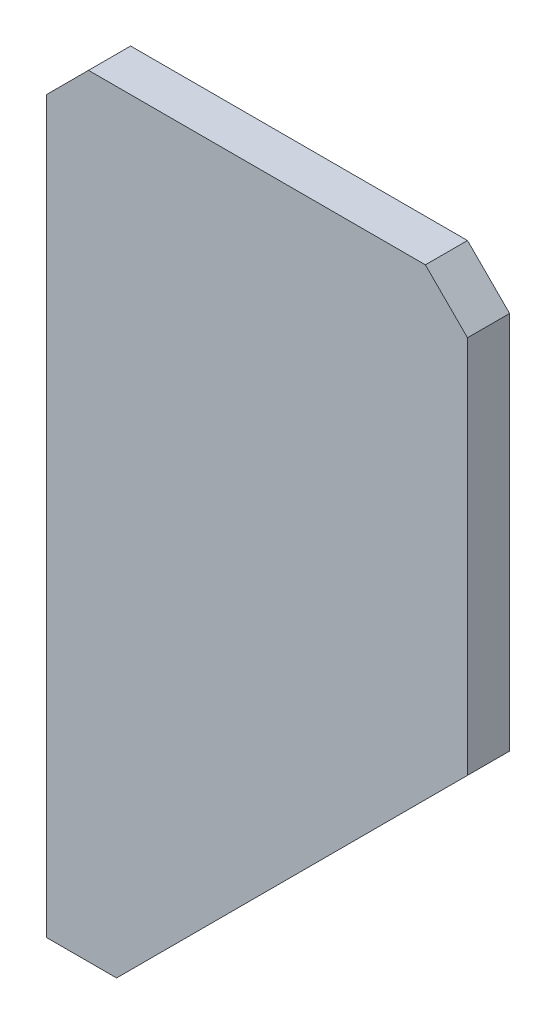
ISO-10303-21;
HEADER;
FILE_DESCRIPTION(('STEP AP214'),'2;1');
FILE_NAME('part.step','',(''),(''),'','','');
FILE_SCHEMA(('AUTOMOTIVE_DESIGN { 1 0 10303 214 1 1 1 1 }'));
ENDSEC;
DATA;
#1=APPLICATION_CONTEXT('core data for automotive mechanical design processes');
#2=APPLICATION_PROTOCOL_DEFINITION('international standard','automotive_design',2000,#1);
#3=PRODUCT_CONTEXT('',#1,'mechanical');
#4=PRODUCT('Part','Part','',(#3));
#5=PRODUCT_RELATED_PRODUCT_CATEGORY('part','',(#4));
#6=PRODUCT_DEFINITION_FORMATION('','',#4);
#7=PRODUCT_DEFINITION_CONTEXT('part definition',#1,'design');
#8=PRODUCT_DEFINITION('design','',#6,#7);
#9=PRODUCT_DEFINITION_SHAPE('','',#8);
#10=(LENGTH_UNIT() NAMED_UNIT(*) SI_UNIT(.MILLI.,.METRE.));
#11=(NAMED_UNIT(*) PLANE_ANGLE_UNIT() SI_UNIT($,.RADIAN.));
#12=(NAMED_UNIT(*) SI_UNIT($,.STERADIAN.) SOLID_ANGLE_UNIT());
#13=UNCERTAINTY_MEASURE_WITH_UNIT(LENGTH_MEASURE(1.E-05),#10,'distance_accuracy_value','');
#14=(GEOMETRIC_REPRESENTATION_CONTEXT(3) GLOBAL_UNCERTAINTY_ASSIGNED_CONTEXT((#13)) GLOBAL_UNIT_ASSIGNED_CONTEXT((#10,
#11,#12)) REPRESENTATION_CONTEXT('',''));
#15=CARTESIAN_POINT('',(0.,0.,0.));
#16=DIRECTION('',(0.,0.,1.));
#17=DIRECTION('',(1.,0.,0.));
#18=AXIS2_PLACEMENT_3D('',#15,#16,#17);
#19=CARTESIAN_POINT('',(15.,-27.5,1.5));
#20=DIRECTION('',(-1.,0.,0.));
#21=DIRECTION('',(0.,0.,1.));
#22=AXIS2_PLACEMENT_3D('',#19,#20,#21);
#23=PLANE('',#22);
#24=DIRECTION('',(0.,1.,0.));
#25=VECTOR('',#24,1.);
#26=CARTESIAN_POINT('',(15.,-27.5,1.5));
#27=LINE('',#26,#25);
#28=CARTESIAN_POINT('',(15.,-2.49999999999993,1.5));
#29=VERTEX_POINT('',#28);
#30=CARTESIAN_POINT('',(15.,24.5,1.5));
#31=VERTEX_POINT('',#30);
#32=EDGE_CURVE('E121',#29,#31,#27,.T.);
#33=ORIENTED_EDGE('',*,*,#32,.F.);
#34=DIRECTION('',(0.,0.,-1.));
#35=VECTOR('',#34,1.);
#36=CARTESIAN_POINT('',(15.,-2.49999999999993,1.5));
#37=LINE('',#36,#35);
#38=CARTESIAN_POINT('',(15.,-2.49999999999993,-1.5));
#39=VERTEX_POINT('',#38);
#40=EDGE_CURVE('E140',#29,#39,#37,.T.);
#41=ORIENTED_EDGE('',*,*,#40,.T.);
#42=DIRECTION('',(0.,1.,0.));
#43=VECTOR('',#42,1.);
#44=CARTESIAN_POINT('',(15.,-27.5,-1.5));
#45=LINE('',#44,#43);
#46=CARTESIAN_POINT('',(15.,24.5,-1.5));
#47=VERTEX_POINT('',#46);
#48=EDGE_CURVE('E114',#39,#47,#45,.T.);
#49=ORIENTED_EDGE('',*,*,#48,.T.);
#50=DIRECTION('',(0.,0.,1.));
#51=VECTOR('',#50,1.);
#52=CARTESIAN_POINT('',(15.,24.5,1.5));
#53=LINE('',#52,#51);
#54=EDGE_CURVE('E137',#47,#31,#53,.T.);
#55=ORIENTED_EDGE('',*,*,#54,.T.);
#56=EDGE_LOOP('',(#33,#41,#49,#55));
#57=FACE_BOUND('',#56,.T.);
#58=ADVANCED_FACE('F32',(#57),#23,.F.);
#59=CARTESIAN_POINT('',(-15.,27.5,1.5));
#60=DIRECTION('',(0.,-1.,0.));
#61=DIRECTION('',(0.,0.,-1.));
#62=AXIS2_PLACEMENT_3D('',#59,#60,#61);
#63=PLANE('',#62);
#64=DIRECTION('',(-1.,0.,0.));
#65=VECTOR('',#64,1.);
#66=CARTESIAN_POINT('',(-15.,27.5,-1.5));
#67=LINE('',#66,#65);
#68=CARTESIAN_POINT('',(12.,27.5,-1.5));
#69=VERTEX_POINT('',#68);
#70=CARTESIAN_POINT('',(-12.,27.5,-1.5));
#71=VERTEX_POINT('',#70);
#72=EDGE_CURVE('E116',#69,#71,#67,.T.);
#73=ORIENTED_EDGE('',*,*,#72,.T.);
#74=DIRECTION('',(0.,0.,1.));
#75=VECTOR('',#74,1.);
#76=CARTESIAN_POINT('',(-12.,27.5,1.5));
#77=LINE('',#76,#75);
#78=CARTESIAN_POINT('',(-12.,27.5,1.5));
#79=VERTEX_POINT('',#78);
#80=EDGE_CURVE('E132',#71,#79,#77,.T.);
#81=ORIENTED_EDGE('',*,*,#80,.T.);
#82=DIRECTION('',(-1.,0.,0.));
#83=VECTOR('',#82,1.);
#84=CARTESIAN_POINT('',(-15.,27.5,1.5));
#85=LINE('',#84,#83);
#86=CARTESIAN_POINT('',(12.,27.5,1.5));
#87=VERTEX_POINT('',#86);
#88=EDGE_CURVE('E101',#87,#79,#85,.T.);
#89=ORIENTED_EDGE('',*,*,#88,.F.);
#90=DIRECTION('',(0.,0.,-1.));
#91=VECTOR('',#90,1.);
#92=CARTESIAN_POINT('',(12.,27.5,1.5));
#93=LINE('',#92,#91);
#94=EDGE_CURVE('E129',#87,#69,#93,.T.);
#95=ORIENTED_EDGE('',*,*,#94,.T.);
#96=EDGE_LOOP('',(#73,#81,#89,#95));
#97=FACE_BOUND('',#96,.T.);
#98=ADVANCED_FACE('F156',(#97),#63,.F.);
#99=CARTESIAN_POINT('',(-15.,-27.5,1.5));
#100=DIRECTION('',(1.,0.,0.));
#101=DIRECTION('',(0.,0.,-1.));
#102=AXIS2_PLACEMENT_3D('',#99,#100,#101);
#103=PLANE('',#102);
#104=DIRECTION('',(0.,-1.,0.));
#105=VECTOR('',#104,1.);
#106=CARTESIAN_POINT('',(-15.,-27.5,1.5));
#107=LINE('',#106,#105);
#108=CARTESIAN_POINT('',(-15.,24.5,1.5));
#109=VERTEX_POINT('',#108);
#110=CARTESIAN_POINT('',(-15.,-27.5,1.5));
#111=VERTEX_POINT('',#110);
#112=EDGE_CURVE('E90',#109,#111,#107,.T.);
#113=ORIENTED_EDGE('',*,*,#112,.F.);
#114=DIRECTION('',(0.,0.,-1.));
#115=VECTOR('',#114,1.);
#116=CARTESIAN_POINT('',(-15.,24.5,1.5));
#117=LINE('',#116,#115);
#118=CARTESIAN_POINT('',(-15.,24.5,-1.5));
#119=VERTEX_POINT('',#118);
#120=EDGE_CURVE('E108',#109,#119,#117,.T.);
#121=ORIENTED_EDGE('',*,*,#120,.T.);
#122=DIRECTION('',(0.,-1.,0.));
#123=VECTOR('',#122,1.);
#124=CARTESIAN_POINT('',(-15.,-27.5,-1.5));
#125=LINE('',#124,#123);
#126=CARTESIAN_POINT('',(-15.,-27.5,-1.5));
#127=VERTEX_POINT('',#126);
#128=EDGE_CURVE('E107',#119,#127,#125,.T.);
#129=ORIENTED_EDGE('',*,*,#128,.T.);
#130=DIRECTION('',(0.,0.,-1.));
#131=VECTOR('',#130,1.);
#132=CARTESIAN_POINT('',(-15.,-27.5,1.5));
#133=LINE('',#132,#131);
#134=EDGE_CURVE('E104',#111,#127,#133,.T.);
#135=ORIENTED_EDGE('',*,*,#134,.F.);
#136=EDGE_LOOP('',(#113,#121,#129,#135));
#137=FACE_BOUND('',#136,.T.);
#138=ADVANCED_FACE('F105',(#137),#103,.F.);
#139=CARTESIAN_POINT('',(-15.,-27.5,1.5));
#140=DIRECTION('',(0.,1.,0.));
#141=DIRECTION('',(0.,0.,1.));
#142=AXIS2_PLACEMENT_3D('',#139,#140,#141);
#143=PLANE('',#142);
#144=DIRECTION('',(1.,0.,0.));
#145=VECTOR('',#144,1.);
#146=CARTESIAN_POINT('',(-15.,-27.5,-1.5));
#147=LINE('',#146,#145);
#148=CARTESIAN_POINT('',(-10.0000000000001,-27.5,-1.5));
#149=VERTEX_POINT('',#148);
#150=EDGE_CURVE('E120',#127,#149,#147,.T.);
#151=ORIENTED_EDGE('',*,*,#150,.T.);
#152=DIRECTION('',(0.,0.,1.));
#153=VECTOR('',#152,1.);
#154=CARTESIAN_POINT('',(-10.0000000000001,-27.5,1.5));
#155=LINE('',#154,#153);
#156=CARTESIAN_POINT('',(-10.0000000000001,-27.5,1.5));
#157=VERTEX_POINT('',#156);
#158=EDGE_CURVE('E40',#149,#157,#155,.T.);
#159=ORIENTED_EDGE('',*,*,#158,.T.);
#160=DIRECTION('',(1.,0.,0.));
#161=VECTOR('',#160,1.);
#162=CARTESIAN_POINT('',(-15.,-27.5,1.5));
#163=LINE('',#162,#161);
#164=EDGE_CURVE('E93',#111,#157,#163,.T.);
#165=ORIENTED_EDGE('',*,*,#164,.F.);
#166=ORIENTED_EDGE('',*,*,#134,.T.);
#167=EDGE_LOOP('',(#151,#159,#165,#166));
#168=FACE_BOUND('',#167,.T.);
#169=ADVANCED_FACE('F110',(#168),#143,.F.);
#170=CARTESIAN_POINT('',(0.,0.,1.5));
#171=DIRECTION('',(0.,0.,-1.));
#172=DIRECTION('',(-1.,0.,0.));
#173=AXIS2_PLACEMENT_3D('',#170,#171,#172);
#174=PLANE('',#173);
#175=ORIENTED_EDGE('',*,*,#164,.T.);
#176=DIRECTION('',(-0.707106781186548,-0.707106781186548,0.));
#177=VECTOR('',#176,1.);
#178=CARTESIAN_POINT('',(15.,-2.49999999999993,1.5));
#179=LINE('',#178,#177);
#180=EDGE_CURVE('E11',#157,#29,#179,.F.);
#181=ORIENTED_EDGE('',*,*,#180,.T.);
#182=ORIENTED_EDGE('',*,*,#32,.T.);
#183=DIRECTION('',(0.707106781186547,-0.707106781186548,0.));
#184=VECTOR('',#183,1.);
#185=CARTESIAN_POINT('',(12.,27.5,1.5));
#186=LINE('',#185,#184);
#187=EDGE_CURVE('E134',#31,#87,#186,.F.);
#188=ORIENTED_EDGE('',*,*,#187,.T.);
#189=ORIENTED_EDGE('',*,*,#88,.T.);
#190=DIRECTION('',(0.707106781186548,0.707106781186548,0.));
#191=VECTOR('',#190,1.);
#192=CARTESIAN_POINT('',(-15.,24.5,1.5));
#193=LINE('',#192,#191);
#194=EDGE_CURVE('E97',#79,#109,#193,.F.);
#195=ORIENTED_EDGE('',*,*,#194,.T.);
#196=ORIENTED_EDGE('',*,*,#112,.T.);
#197=EDGE_LOOP('',(#175,#181,#182,#188,#189,#195,#196));
#198=FACE_BOUND('',#197,.T.);
#199=ADVANCED_FACE('F92',(#198),#174,.F.);
#200=CARTESIAN_POINT('',(0.,0.,-1.5));
#201=DIRECTION('',(0.,0.,-1.));
#202=DIRECTION('',(-1.,0.,0.));
#203=AXIS2_PLACEMENT_3D('',#200,#201,#202);
#204=PLANE('',#203);
#205=ORIENTED_EDGE('',*,*,#48,.F.);
#206=DIRECTION('',(0.707106781186548,0.707106781186548,0.));
#207=VECTOR('',#206,1.);
#208=CARTESIAN_POINT('',(8.74999999999996,-8.74999999999996,-1.5));
#209=LINE('',#208,#207);
#210=EDGE_CURVE('E54',#39,#149,#209,.F.);
#211=ORIENTED_EDGE('',*,*,#210,.T.);
#212=ORIENTED_EDGE('',*,*,#150,.F.);
#213=ORIENTED_EDGE('',*,*,#128,.F.);
#214=DIRECTION('',(-0.707106781186548,-0.707106781186548,0.));
#215=VECTOR('',#214,1.);
#216=CARTESIAN_POINT('',(-19.75,19.75,-1.5));
#217=LINE('',#216,#215);
#218=EDGE_CURVE('E127',#119,#71,#217,.F.);
#219=ORIENTED_EDGE('',*,*,#218,.T.);
#220=ORIENTED_EDGE('',*,*,#72,.F.);
#221=DIRECTION('',(-0.707106781186547,0.707106781186548,0.));
#222=VECTOR('',#221,1.);
#223=CARTESIAN_POINT('',(19.75,19.75,-1.5));
#224=LINE('',#223,#222);
#225=EDGE_CURVE('E124',#69,#47,#224,.F.);
#226=ORIENTED_EDGE('',*,*,#225,.T.);
#227=EDGE_LOOP('',(#205,#211,#212,#213,#219,#220,#226));
#228=FACE_BOUND('',#227,.T.);
#229=ADVANCED_FACE('F147',(#228),#204,.T.);
#230=CARTESIAN_POINT('',(-15.,24.5,1.5));
#231=DIRECTION('',(0.707106781186547,-0.707106781186547,0.));
#232=DIRECTION('',(0.,0.,-1.));
#233=AXIS2_PLACEMENT_3D('',#230,#231,#232);
#234=PLANE('',#233);
#235=ORIENTED_EDGE('',*,*,#194,.F.);
#236=ORIENTED_EDGE('',*,*,#80,.F.);
#237=ORIENTED_EDGE('',*,*,#218,.F.);
#238=ORIENTED_EDGE('',*,*,#120,.F.);
#239=EDGE_LOOP('',(#235,#236,#237,#238));
#240=FACE_BOUND('',#239,.T.);
#241=ADVANCED_FACE('F160',(#240),#234,.F.);
#242=CARTESIAN_POINT('',(12.,27.5,1.5));
#243=DIRECTION('',(-0.707106781186548,-0.707106781186547,0.));
#244=DIRECTION('',(0.,0.,-1.));
#245=AXIS2_PLACEMENT_3D('',#242,#243,#244);
#246=PLANE('',#245);
#247=ORIENTED_EDGE('',*,*,#187,.F.);
#248=ORIENTED_EDGE('',*,*,#54,.F.);
#249=ORIENTED_EDGE('',*,*,#225,.F.);
#250=ORIENTED_EDGE('',*,*,#94,.F.);
#251=EDGE_LOOP('',(#247,#248,#249,#250));
#252=FACE_BOUND('',#251,.T.);
#253=ADVANCED_FACE('F153',(#252),#246,.F.);
#254=CARTESIAN_POINT('',(15.,-2.49999999999993,1.5));
#255=DIRECTION('',(-0.707106781186548,0.707106781186548,0.));
#256=DIRECTION('',(0.,0.,-1.));
#257=AXIS2_PLACEMENT_3D('',#254,#255,#256);
#258=PLANE('',#257);
#259=ORIENTED_EDGE('',*,*,#180,.F.);
#260=ORIENTED_EDGE('',*,*,#158,.F.);
#261=ORIENTED_EDGE('',*,*,#210,.F.);
#262=ORIENTED_EDGE('',*,*,#40,.F.);
#263=EDGE_LOOP('',(#259,#260,#261,#262));
#264=FACE_BOUND('',#263,.T.);
#265=ADVANCED_FACE('F34',(#264),#258,.F.);
#266=CLOSED_SHELL('',(#58,#98,#138,#169,#199,#229,#241,#253,#265));
#267=MANIFOLD_SOLID_BREP('B2',#266);
#268=ADVANCED_BREP_SHAPE_REPRESENTATION('',(#18,#267),#14);
#269=SHAPE_DEFINITION_REPRESENTATION(#9,#268);
ENDSEC;
END-ISO-10303-21;
